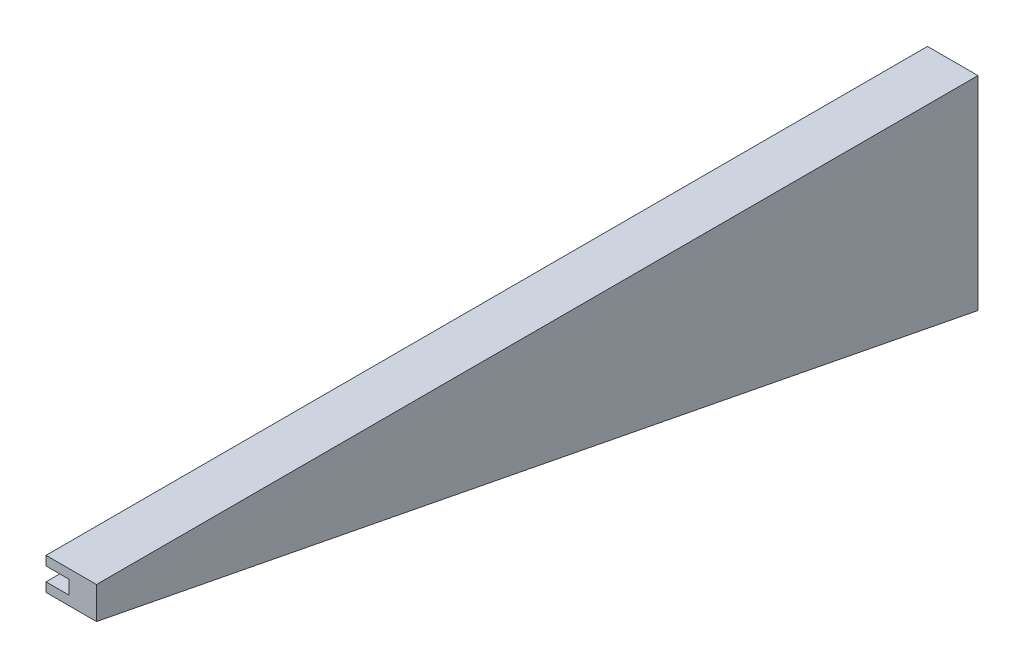
ISO-10303-21;
HEADER;
FILE_DESCRIPTION(('STEP AP214'),'2;1');
FILE_NAME('part.step','',(''),(''),'','','');
FILE_SCHEMA(('AUTOMOTIVE_DESIGN { 1 0 10303 214 1 1 1 1 }'));
ENDSEC;
DATA;
#1=APPLICATION_CONTEXT('core data for automotive mechanical design processes');
#2=APPLICATION_PROTOCOL_DEFINITION('international standard','automotive_design',2000,#1);
#3=PRODUCT_CONTEXT('',#1,'mechanical');
#4=PRODUCT('Part','Part','',(#3));
#5=PRODUCT_RELATED_PRODUCT_CATEGORY('part','',(#4));
#6=PRODUCT_DEFINITION_FORMATION('','',#4);
#7=PRODUCT_DEFINITION_CONTEXT('part definition',#1,'design');
#8=PRODUCT_DEFINITION('design','',#6,#7);
#9=PRODUCT_DEFINITION_SHAPE('','',#8);
#10=(LENGTH_UNIT() NAMED_UNIT(*) SI_UNIT(.MILLI.,.METRE.));
#11=(NAMED_UNIT(*) PLANE_ANGLE_UNIT() SI_UNIT($,.RADIAN.));
#12=(NAMED_UNIT(*) SI_UNIT($,.STERADIAN.) SOLID_ANGLE_UNIT());
#13=UNCERTAINTY_MEASURE_WITH_UNIT(LENGTH_MEASURE(1.E-05),#10,'distance_accuracy_value','');
#14=(GEOMETRIC_REPRESENTATION_CONTEXT(3) GLOBAL_UNCERTAINTY_ASSIGNED_CONTEXT((#13)) GLOBAL_UNIT_ASSIGNED_CONTEXT((#10,
#11,#12)) REPRESENTATION_CONTEXT('',''));
#15=CARTESIAN_POINT('',(0.,0.,0.));
#16=DIRECTION('',(0.,0.,1.));
#17=DIRECTION('',(1.,0.,0.));
#18=AXIS2_PLACEMENT_3D('',#15,#16,#17);
#19=CARTESIAN_POINT('',(-4.,-3.5,192.));
#20=DIRECTION('',(1.,0.,0.));
#21=DIRECTION('',(0.,0.,-1.));
#22=AXIS2_PLACEMENT_3D('',#19,#20,#21);
#23=PLANE('',#22);
#24=DIRECTION('',(0.,-1.,0.));
#25=VECTOR('',#24,1.);
#26=CARTESIAN_POINT('',(-4.,-3.5,0.));
#27=LINE('',#26,#25);
#28=CARTESIAN_POINT('',(-4.,3.5,0.));
#29=VERTEX_POINT('',#28);
#30=CARTESIAN_POINT('',(-4.,1.5,0.));
#31=VERTEX_POINT('',#30);
#32=EDGE_CURVE('E172',#29,#31,#27,.T.);
#33=ORIENTED_EDGE('',*,*,#32,.T.);
#34=DIRECTION('',(0.,0.,1.));
#35=VECTOR('',#34,1.);
#36=CARTESIAN_POINT('',(-4.,1.5,0.));
#37=LINE('',#36,#35);
#38=CARTESIAN_POINT('',(-4.,1.5,192.));
#39=VERTEX_POINT('',#38);
#40=EDGE_CURVE('E212',#31,#39,#37,.T.);
#41=ORIENTED_EDGE('',*,*,#40,.T.);
#42=DIRECTION('',(0.,-1.,0.));
#43=VECTOR('',#42,1.);
#44=CARTESIAN_POINT('',(-4.,-3.5,192.));
#45=LINE('',#44,#43);
#46=CARTESIAN_POINT('',(-4.,3.5,192.));
#47=VERTEX_POINT('',#46);
#48=EDGE_CURVE('E168',#47,#39,#45,.T.);
#49=ORIENTED_EDGE('',*,*,#48,.F.);
#50=DIRECTION('',(0.,0.,-1.));
#51=VECTOR('',#50,1.);
#52=CARTESIAN_POINT('',(-4.,3.5,192.));
#53=LINE('',#52,#51);
#54=EDGE_CURVE('E164',#47,#29,#53,.T.);
#55=ORIENTED_EDGE('',*,*,#54,.T.);
#56=EDGE_LOOP('',(#33,#41,#49,#55));
#57=FACE_BOUND('',#56,.T.);
#58=ADVANCED_FACE('F37',(#57),#23,.F.);
#59=CARTESIAN_POINT('',(-4.,-1.5,192.));
#60=VERTEX_POINT('',#59);
#61=CARTESIAN_POINT('',(-4.,-3.5,192.));
#62=VERTEX_POINT('',#61);
#63=EDGE_CURVE('E83',#60,#62,#45,.T.);
#64=ORIENTED_EDGE('',*,*,#63,.F.);
#65=DIRECTION('',(0.,0.,1.));
#66=VECTOR('',#65,1.);
#67=CARTESIAN_POINT('',(-4.,-1.5,0.));
#68=LINE('',#67,#66);
#69=CARTESIAN_POINT('',(-4.,-1.5,0.));
#70=VERTEX_POINT('',#69);
#71=EDGE_CURVE('E215',#70,#60,#68,.T.);
#72=ORIENTED_EDGE('',*,*,#71,.F.);
#73=CARTESIAN_POINT('',(-4.,-3.5,0.));
#74=VERTEX_POINT('',#73);
#75=EDGE_CURVE('E176',#70,#74,#27,.T.);
#76=ORIENTED_EDGE('',*,*,#75,.T.);
#77=DIRECTION('',(0.,0.,-1.));
#78=VECTOR('',#77,1.);
#79=CARTESIAN_POINT('',(-4.,-3.5,192.));
#80=LINE('',#79,#78);
#81=EDGE_CURVE('E11',#62,#74,#80,.T.);
#82=ORIENTED_EDGE('',*,*,#81,.F.);
#83=EDGE_LOOP('',(#64,#72,#76,#82));
#84=FACE_BOUND('',#83,.T.);
#85=ADVANCED_FACE('F39',(#84),#23,.F.);
#86=CARTESIAN_POINT('',(4.,-3.5,192.));
#87=DIRECTION('',(0.,1.,0.));
#88=DIRECTION('',(0.,0.,1.));
#89=AXIS2_PLACEMENT_3D('',#86,#87,#88);
#90=PLANE('',#89);
#91=DIRECTION('',(1.,0.,0.));
#92=VECTOR('',#91,1.);
#93=CARTESIAN_POINT('',(4.,-3.5,0.));
#94=LINE('',#93,#92);
#95=CARTESIAN_POINT('',(4.,-3.5,0.));
#96=VERTEX_POINT('',#95);
#97=EDGE_CURVE('E175',#74,#96,#94,.T.);
#98=ORIENTED_EDGE('',*,*,#97,.T.);
#99=DIRECTION('',(0.,0.,-1.));
#100=VECTOR('',#99,1.);
#101=CARTESIAN_POINT('',(4.,-3.5,192.));
#102=LINE('',#101,#100);
#103=CARTESIAN_POINT('',(4.,-3.5,192.));
#104=VERTEX_POINT('',#103);
#105=EDGE_CURVE('E46',#104,#96,#102,.T.);
#106=ORIENTED_EDGE('',*,*,#105,.F.);
#107=DIRECTION('',(1.,0.,0.));
#108=VECTOR('',#107,1.);
#109=CARTESIAN_POINT('',(4.,-3.5,192.));
#110=LINE('',#109,#108);
#111=EDGE_CURVE('E143',#62,#104,#110,.T.);
#112=ORIENTED_EDGE('',*,*,#111,.F.);
#113=ORIENTED_EDGE('',*,*,#81,.T.);
#114=EDGE_LOOP('',(#98,#106,#112,#113));
#115=FACE_BOUND('',#114,.T.);
#116=ADVANCED_FACE('F183',(#115),#90,.F.);
#117=CARTESIAN_POINT('',(4.,3.5,192.));
#118=DIRECTION('',(0.,-1.,0.));
#119=DIRECTION('',(0.,0.,-1.));
#120=AXIS2_PLACEMENT_3D('',#117,#118,#119);
#121=PLANE('',#120);
#122=DIRECTION('',(-1.,0.,0.));
#123=VECTOR('',#122,1.);
#124=CARTESIAN_POINT('',(4.,3.5,0.));
#125=LINE('',#124,#123);
#126=CARTESIAN_POINT('',(7.,3.5,0.));
#127=VERTEX_POINT('',#126);
#128=EDGE_CURVE('E78',#127,#29,#125,.T.);
#129=ORIENTED_EDGE('',*,*,#128,.T.);
#130=ORIENTED_EDGE('',*,*,#54,.F.);
#131=DIRECTION('',(-1.,0.,0.));
#132=VECTOR('',#131,1.);
#133=CARTESIAN_POINT('',(4.,3.5,192.));
#134=LINE('',#133,#132);
#135=CARTESIAN_POINT('',(7.,3.5,192.));
#136=VERTEX_POINT('',#135);
#137=EDGE_CURVE('E63',#136,#47,#134,.T.);
#138=ORIENTED_EDGE('',*,*,#137,.F.);
#139=DIRECTION('',(0.,0.,1.));
#140=VECTOR('',#139,1.);
#141=CARTESIAN_POINT('',(7.,3.5,0.));
#142=LINE('',#141,#140);
#143=EDGE_CURVE('E138',#127,#136,#142,.T.);
#144=ORIENTED_EDGE('',*,*,#143,.F.);
#145=EDGE_LOOP('',(#129,#130,#138,#144));
#146=FACE_BOUND('',#145,.T.);
#147=ADVANCED_FACE('F163',(#146),#121,.F.);
#148=CARTESIAN_POINT('',(0.,0.,192.));
#149=DIRECTION('',(0.,0.,1.));
#150=DIRECTION('',(1.,0.,0.));
#151=AXIS2_PLACEMENT_3D('',#148,#149,#150);
#152=PLANE('',#151);
#153=DIRECTION('',(-1.,0.,0.));
#154=VECTOR('',#153,1.);
#155=CARTESIAN_POINT('',(-4.,1.5,192.));
#156=LINE('',#155,#154);
#157=CARTESIAN_POINT('',(0.999999999999999,1.5,192.));
#158=VERTEX_POINT('',#157);
#159=EDGE_CURVE('E222',#158,#39,#156,.T.);
#160=ORIENTED_EDGE('',*,*,#159,.F.);
#161=DIRECTION('',(0.,1.,0.));
#162=VECTOR('',#161,1.);
#163=CARTESIAN_POINT('',(0.999999999999999,1.5,192.));
#164=LINE('',#163,#162);
#165=CARTESIAN_POINT('',(0.999999999999999,-1.5,192.));
#166=VERTEX_POINT('',#165);
#167=EDGE_CURVE('E148',#166,#158,#164,.T.);
#168=ORIENTED_EDGE('',*,*,#167,.F.);
#169=DIRECTION('',(1.,0.,0.));
#170=VECTOR('',#169,1.);
#171=CARTESIAN_POINT('',(-4.,-1.5,192.));
#172=LINE('',#171,#170);
#173=EDGE_CURVE('E145',#60,#166,#172,.T.);
#174=ORIENTED_EDGE('',*,*,#173,.F.);
#175=ORIENTED_EDGE('',*,*,#63,.T.);
#176=ORIENTED_EDGE('',*,*,#111,.T.);
#177=DIRECTION('',(-1.,0.,0.));
#178=VECTOR('',#177,1.);
#179=CARTESIAN_POINT('',(7.,-3.5,192.));
#180=LINE('',#179,#178);
#181=CARTESIAN_POINT('',(7.,-3.5,192.));
#182=VERTEX_POINT('',#181);
#183=EDGE_CURVE('E127',#182,#104,#180,.T.);
#184=ORIENTED_EDGE('',*,*,#183,.F.);
#185=DIRECTION('',(0.,-1.,0.));
#186=VECTOR('',#185,1.);
#187=CARTESIAN_POINT('',(7.,3.5,192.));
#188=LINE('',#187,#186);
#189=EDGE_CURVE('E134',#136,#182,#188,.T.);
#190=ORIENTED_EDGE('',*,*,#189,.F.);
#191=ORIENTED_EDGE('',*,*,#137,.T.);
#192=ORIENTED_EDGE('',*,*,#48,.T.);
#193=EDGE_LOOP('',(#160,#168,#174,#175,#176,#184,#190,#191,#192));
#194=FACE_BOUND('',#193,.T.);
#195=ADVANCED_FACE('F142',(#194),#152,.T.);
#196=CARTESIAN_POINT('',(0.,0.,0.));
#197=DIRECTION('',(0.,0.,1.));
#198=DIRECTION('',(1.,0.,0.));
#199=AXIS2_PLACEMENT_3D('',#196,#197,#198);
#200=PLANE('',#199);
#201=DIRECTION('',(0.,1.,0.));
#202=VECTOR('',#201,1.);
#203=CARTESIAN_POINT('',(0.999999999999999,1.5,0.));
#204=LINE('',#203,#202);
#205=CARTESIAN_POINT('',(0.999999999999999,-1.5,0.));
#206=VERTEX_POINT('',#205);
#207=CARTESIAN_POINT('',(0.999999999999999,1.5,0.));
#208=VERTEX_POINT('',#207);
#209=EDGE_CURVE('E54',#206,#208,#204,.T.);
#210=ORIENTED_EDGE('',*,*,#209,.T.);
#211=DIRECTION('',(-1.,0.,0.));
#212=VECTOR('',#211,1.);
#213=CARTESIAN_POINT('',(-4.,1.5,0.));
#214=LINE('',#213,#212);
#215=EDGE_CURVE('E214',#208,#31,#214,.T.);
#216=ORIENTED_EDGE('',*,*,#215,.T.);
#217=ORIENTED_EDGE('',*,*,#32,.F.);
#218=ORIENTED_EDGE('',*,*,#128,.F.);
#219=DIRECTION('',(0.,1.,0.));
#220=VECTOR('',#219,1.);
#221=CARTESIAN_POINT('',(7.,-40.821019354442,0.));
#222=LINE('',#221,#220);
#223=CARTESIAN_POINT('',(7.,-40.821019354442,0.));
#224=VERTEX_POINT('',#223);
#225=EDGE_CURVE('E133',#224,#127,#222,.T.);
#226=ORIENTED_EDGE('',*,*,#225,.F.);
#227=DIRECTION('',(-1.,0.,0.));
#228=VECTOR('',#227,1.);
#229=CARTESIAN_POINT('',(7.,-40.821019354442,0.));
#230=LINE('',#229,#228);
#231=CARTESIAN_POINT('',(4.,-40.821019354442,0.));
#232=VERTEX_POINT('',#231);
#233=EDGE_CURVE('E129',#224,#232,#230,.T.);
#234=ORIENTED_EDGE('',*,*,#233,.T.);
#235=DIRECTION('',(0.,1.,0.));
#236=VECTOR('',#235,1.);
#237=CARTESIAN_POINT('',(4.,-3.5,0.));
#238=LINE('',#237,#236);
#239=EDGE_CURVE('E139',#232,#96,#238,.T.);
#240=ORIENTED_EDGE('',*,*,#239,.T.);
#241=ORIENTED_EDGE('',*,*,#97,.F.);
#242=ORIENTED_EDGE('',*,*,#75,.F.);
#243=DIRECTION('',(1.,0.,0.));
#244=VECTOR('',#243,1.);
#245=CARTESIAN_POINT('',(-4.,-1.5,0.));
#246=LINE('',#245,#244);
#247=EDGE_CURVE('E156',#70,#206,#246,.T.);
#248=ORIENTED_EDGE('',*,*,#247,.T.);
#249=EDGE_LOOP('',(#210,#216,#217,#218,#226,#234,#240,#241,#242,#248));
#250=FACE_BOUND('',#249,.T.);
#251=ADVANCED_FACE('F189',(#250),#200,.F.);
#252=CARTESIAN_POINT('',(-4.,1.5,0.));
#253=DIRECTION('',(0.,1.,0.));
#254=DIRECTION('',(0.,0.,1.));
#255=AXIS2_PLACEMENT_3D('',#252,#253,#254);
#256=PLANE('',#255);
#257=ORIENTED_EDGE('',*,*,#159,.T.);
#258=ORIENTED_EDGE('',*,*,#40,.F.);
#259=ORIENTED_EDGE('',*,*,#215,.F.);
#260=DIRECTION('',(0.,0.,1.));
#261=VECTOR('',#260,1.);
#262=CARTESIAN_POINT('',(0.999999999999999,1.5,0.));
#263=LINE('',#262,#261);
#264=EDGE_CURVE('E225',#208,#158,#263,.T.);
#265=ORIENTED_EDGE('',*,*,#264,.T.);
#266=EDGE_LOOP('',(#257,#258,#259,#265));
#267=FACE_BOUND('',#266,.T.);
#268=ADVANCED_FACE('F193',(#267),#256,.F.);
#269=CARTESIAN_POINT('',(0.999999999999999,1.5,0.));
#270=DIRECTION('',(1.,0.,0.));
#271=DIRECTION('',(0.,1.,0.));
#272=AXIS2_PLACEMENT_3D('',#269,#270,#271);
#273=PLANE('',#272);
#274=ORIENTED_EDGE('',*,*,#167,.T.);
#275=ORIENTED_EDGE('',*,*,#264,.F.);
#276=ORIENTED_EDGE('',*,*,#209,.F.);
#277=DIRECTION('',(0.,0.,1.));
#278=VECTOR('',#277,1.);
#279=CARTESIAN_POINT('',(0.999999999999999,-1.5,0.));
#280=LINE('',#279,#278);
#281=EDGE_CURVE('E217',#206,#166,#280,.T.);
#282=ORIENTED_EDGE('',*,*,#281,.T.);
#283=EDGE_LOOP('',(#274,#275,#276,#282));
#284=FACE_BOUND('',#283,.T.);
#285=ADVANCED_FACE('F199',(#284),#273,.F.);
#286=CARTESIAN_POINT('',(-4.,-1.5,0.));
#287=DIRECTION('',(0.,-1.,0.));
#288=DIRECTION('',(0.,0.,-1.));
#289=AXIS2_PLACEMENT_3D('',#286,#287,#288);
#290=PLANE('',#289);
#291=ORIENTED_EDGE('',*,*,#173,.T.);
#292=ORIENTED_EDGE('',*,*,#281,.F.);
#293=ORIENTED_EDGE('',*,*,#247,.F.);
#294=ORIENTED_EDGE('',*,*,#71,.T.);
#295=EDGE_LOOP('',(#291,#292,#293,#294));
#296=FACE_BOUND('',#295,.T.);
#297=ADVANCED_FACE('F229',(#296),#290,.F.);
#298=CARTESIAN_POINT('',(7.,-3.5,192.));
#299=DIRECTION('',(0.,0.981627183447664,-0.190808995376545));
#300=DIRECTION('',(0.,0.190808995376545,0.981627183447664));
#301=AXIS2_PLACEMENT_3D('',#298,#299,#300);
#302=PLANE('',#301);
#303=DIRECTION('',(0.,-0.190808995376545,-0.981627183447664));
#304=VECTOR('',#303,1.);
#305=CARTESIAN_POINT('',(4.,-3.5,192.));
#306=LINE('',#305,#304);
#307=EDGE_CURVE('E155',#104,#232,#306,.T.);
#308=ORIENTED_EDGE('',*,*,#307,.T.);
#309=ORIENTED_EDGE('',*,*,#233,.F.);
#310=DIRECTION('',(0.,-0.190808995376545,-0.981627183447664));
#311=VECTOR('',#310,1.);
#312=CARTESIAN_POINT('',(7.,-3.5,192.));
#313=LINE('',#312,#311);
#314=EDGE_CURVE('E122',#182,#224,#313,.T.);
#315=ORIENTED_EDGE('',*,*,#314,.F.);
#316=ORIENTED_EDGE('',*,*,#183,.T.);
#317=EDGE_LOOP('',(#308,#309,#315,#316));
#318=FACE_BOUND('',#317,.T.);
#319=ADVANCED_FACE('F125',(#318),#302,.F.);
#320=CARTESIAN_POINT('',(7.,0.,0.));
#321=DIRECTION('',(-1.,0.,0.));
#322=DIRECTION('',(0.,0.,1.));
#323=AXIS2_PLACEMENT_3D('',#320,#321,#322);
#324=PLANE('',#323);
#325=ORIENTED_EDGE('',*,*,#189,.T.);
#326=ORIENTED_EDGE('',*,*,#314,.T.);
#327=ORIENTED_EDGE('',*,*,#225,.T.);
#328=ORIENTED_EDGE('',*,*,#143,.T.);
#329=EDGE_LOOP('',(#325,#326,#327,#328));
#330=FACE_BOUND('',#329,.T.);
#331=ADVANCED_FACE('F137',(#330),#324,.F.);
#332=CARTESIAN_POINT('',(4.,0.,0.));
#333=DIRECTION('',(-1.,0.,0.));
#334=DIRECTION('',(0.,0.,1.));
#335=AXIS2_PLACEMENT_3D('',#332,#333,#334);
#336=PLANE('',#335);
#337=ORIENTED_EDGE('',*,*,#307,.F.);
#338=ORIENTED_EDGE('',*,*,#105,.T.);
#339=ORIENTED_EDGE('',*,*,#239,.F.);
#340=EDGE_LOOP('',(#337,#338,#339));
#341=FACE_BOUND('',#340,.T.);
#342=ADVANCED_FACE('F188',(#341),#336,.T.);
#343=CLOSED_SHELL('',(#58,#85,#116,#147,#195,#251,#268,#285,#297,#319,#331,#342));
#344=MANIFOLD_SOLID_BREP('B2',#343);
#345=ADVANCED_BREP_SHAPE_REPRESENTATION('',(#18,#344),#14);
#346=SHAPE_DEFINITION_REPRESENTATION(#9,#345);
ENDSEC;
END-ISO-10303-21;
